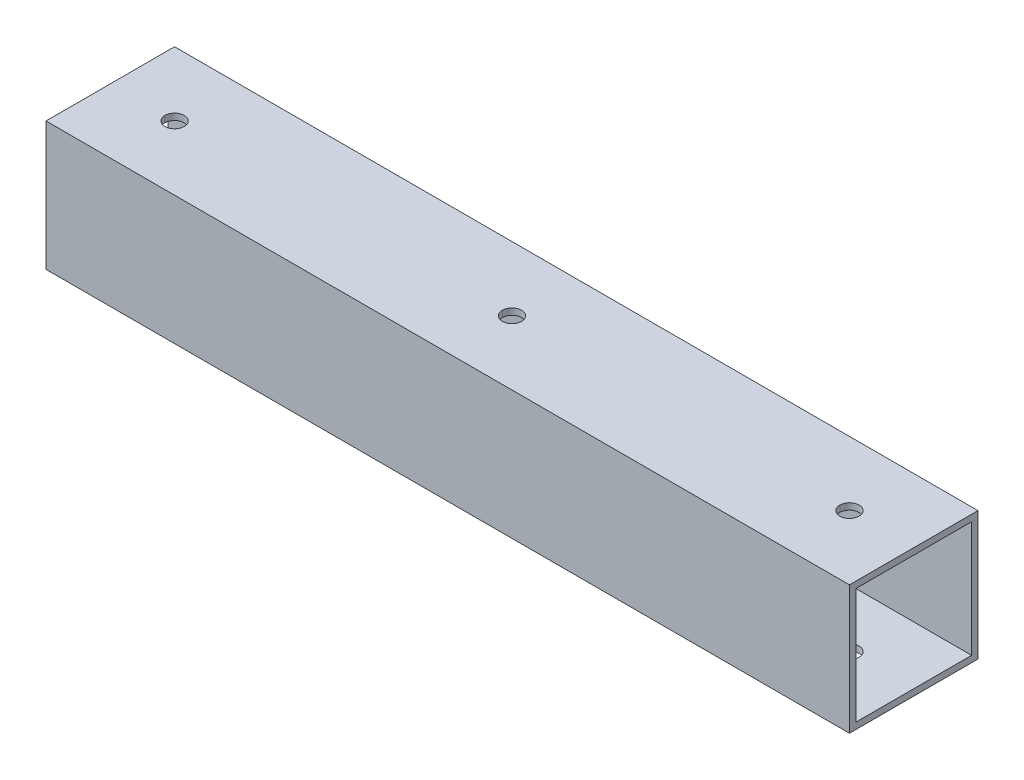
ISO-10303-21;
HEADER;
FILE_DESCRIPTION(('STEP AP214'),'2;1');
FILE_NAME('part.step','',(''),(''),'','','');
FILE_SCHEMA(('AUTOMOTIVE_DESIGN { 1 0 10303 214 1 1 1 1 }'));
ENDSEC;
DATA;
#1=APPLICATION_CONTEXT('core data for automotive mechanical design processes');
#2=APPLICATION_PROTOCOL_DEFINITION('international standard','automotive_design',2000,#1);
#3=PRODUCT_CONTEXT('',#1,'mechanical');
#4=PRODUCT('Part','Part','',(#3));
#5=PRODUCT_RELATED_PRODUCT_CATEGORY('part','',(#4));
#6=PRODUCT_DEFINITION_FORMATION('','',#4);
#7=PRODUCT_DEFINITION_CONTEXT('part definition',#1,'design');
#8=PRODUCT_DEFINITION('design','',#6,#7);
#9=PRODUCT_DEFINITION_SHAPE('','',#8);
#10=(LENGTH_UNIT() NAMED_UNIT(*) SI_UNIT(.MILLI.,.METRE.));
#11=(NAMED_UNIT(*) PLANE_ANGLE_UNIT() SI_UNIT($,.RADIAN.));
#12=(NAMED_UNIT(*) SI_UNIT($,.STERADIAN.) SOLID_ANGLE_UNIT());
#13=UNCERTAINTY_MEASURE_WITH_UNIT(LENGTH_MEASURE(1.E-05),#10,'distance_accuracy_value','');
#14=(GEOMETRIC_REPRESENTATION_CONTEXT(3) GLOBAL_UNCERTAINTY_ASSIGNED_CONTEXT((#13)) GLOBAL_UNIT_ASSIGNED_CONTEXT((#10,
#11,#12)) REPRESENTATION_CONTEXT('',''));
#15=CARTESIAN_POINT('',(0.,0.,0.));
#16=DIRECTION('',(0.,0.,1.));
#17=DIRECTION('',(1.,0.,0.));
#18=AXIS2_PLACEMENT_3D('',#15,#16,#17);
#19=CARTESIAN_POINT('',(-52.5,10.,0.));
#20=DIRECTION('',(0.,1.,0.));
#21=DIRECTION('',(-1.,0.,0.));
#22=AXIS2_PLACEMENT_3D('',#19,#20,#21);
#23=CYLINDRICAL_SURFACE('',#22,1.5);
#24=CARTESIAN_POINT('',(-52.5,-10.,0.));
#25=DIRECTION('',(0.,1.,0.));
#26=DIRECTION('',(1.,0.,0.));
#27=AXIS2_PLACEMENT_3D('',#24,#25,#26);
#28=CIRCLE('',#27,1.5);
#29=CARTESIAN_POINT('',(-51.,-10.,0.));
#30=VERTEX_POINT('',#29);
#31=CARTESIAN_POINT('',(-54.,-10.,0.));
#32=VERTEX_POINT('',#31);
#33=EDGE_CURVE('E31',#30,#32,#28,.T.);
#34=ORIENTED_EDGE('',*,*,#33,.F.);
#35=DIRECTION('',(0.,-1.,0.));
#36=VECTOR('',#35,1.);
#37=CARTESIAN_POINT('',(-51.,-9.,0.));
#38=LINE('',#37,#36);
#39=CARTESIAN_POINT('',(-51.,-9.,0.));
#40=VERTEX_POINT('',#39);
#41=EDGE_CURVE('E11',#40,#30,#38,.T.);
#42=ORIENTED_EDGE('',*,*,#41,.F.);
#43=CARTESIAN_POINT('',(-52.5,-9.,0.));
#44=DIRECTION('',(0.,1.,0.));
#45=DIRECTION('',(1.,0.,0.));
#46=AXIS2_PLACEMENT_3D('',#43,#44,#45);
#47=CIRCLE('',#46,1.5);
#48=CARTESIAN_POINT('',(-54.,-9.,0.));
#49=VERTEX_POINT('',#48);
#50=EDGE_CURVE('E259',#40,#49,#47,.T.);
#51=ORIENTED_EDGE('',*,*,#50,.T.);
#52=DIRECTION('',(0.,-1.,0.));
#53=VECTOR('',#52,1.);
#54=CARTESIAN_POINT('',(-54.,-9.,0.));
#55=LINE('',#54,#53);
#56=EDGE_CURVE('E24',#49,#32,#55,.T.);
#57=ORIENTED_EDGE('',*,*,#56,.T.);
#58=EDGE_LOOP('',(#34,#42,#51,#57));
#59=FACE_BOUND('',#58,.T.);
#60=ADVANCED_FACE('F17',(#59),#23,.F.);
#61=CARTESIAN_POINT('',(-52.5,10.,0.));
#62=DIRECTION('',(0.,1.,0.));
#63=DIRECTION('',(-1.,0.,0.));
#64=AXIS2_PLACEMENT_3D('',#61,#62,#63);
#65=CYLINDRICAL_SURFACE('',#64,1.5);
#66=CARTESIAN_POINT('',(-52.5,-9.,0.));
#67=DIRECTION('',(0.,1.,0.));
#68=DIRECTION('',(-1.,0.,0.));
#69=AXIS2_PLACEMENT_3D('',#66,#67,#68);
#70=CIRCLE('',#69,1.5);
#71=EDGE_CURVE('E257',#49,#40,#70,.T.);
#72=ORIENTED_EDGE('',*,*,#71,.T.);
#73=ORIENTED_EDGE('',*,*,#41,.T.);
#74=CARTESIAN_POINT('',(-52.5,-10.,0.));
#75=DIRECTION('',(0.,1.,0.));
#76=DIRECTION('',(-1.,0.,0.));
#77=AXIS2_PLACEMENT_3D('',#74,#75,#76);
#78=CIRCLE('',#77,1.5);
#79=EDGE_CURVE('E199',#32,#30,#78,.T.);
#80=ORIENTED_EDGE('',*,*,#79,.F.);
#81=ORIENTED_EDGE('',*,*,#56,.F.);
#82=EDGE_LOOP('',(#72,#73,#80,#81));
#83=FACE_BOUND('',#82,.T.);
#84=ADVANCED_FACE('F312',(#83),#65,.F.);
#85=CARTESIAN_POINT('',(52.5,10.,0.));
#86=DIRECTION('',(0.,1.,0.));
#87=DIRECTION('',(-1.,0.,0.));
#88=AXIS2_PLACEMENT_3D('',#85,#86,#87);
#89=CYLINDRICAL_SURFACE('',#88,1.5);
#90=CARTESIAN_POINT('',(52.5,-10.,0.));
#91=DIRECTION('',(0.,1.,0.));
#92=DIRECTION('',(1.,0.,0.));
#93=AXIS2_PLACEMENT_3D('',#90,#91,#92);
#94=CIRCLE('',#93,1.5);
#95=CARTESIAN_POINT('',(54.,-10.,0.));
#96=VERTEX_POINT('',#95);
#97=CARTESIAN_POINT('',(51.,-10.,0.));
#98=VERTEX_POINT('',#97);
#99=EDGE_CURVE('E196',#96,#98,#94,.T.);
#100=ORIENTED_EDGE('',*,*,#99,.F.);
#101=DIRECTION('',(0.,-1.,0.));
#102=VECTOR('',#101,1.);
#103=CARTESIAN_POINT('',(54.,-9.,0.));
#104=LINE('',#103,#102);
#105=CARTESIAN_POINT('',(54.,-9.,0.));
#106=VERTEX_POINT('',#105);
#107=EDGE_CURVE('E305',#106,#96,#104,.T.);
#108=ORIENTED_EDGE('',*,*,#107,.F.);
#109=CARTESIAN_POINT('',(52.5,-9.,0.));
#110=DIRECTION('',(0.,1.,0.));
#111=DIRECTION('',(1.,0.,0.));
#112=AXIS2_PLACEMENT_3D('',#109,#110,#111);
#113=CIRCLE('',#112,1.5);
#114=CARTESIAN_POINT('',(51.,-9.,0.));
#115=VERTEX_POINT('',#114);
#116=EDGE_CURVE('E255',#106,#115,#113,.T.);
#117=ORIENTED_EDGE('',*,*,#116,.T.);
#118=DIRECTION('',(0.,-1.,0.));
#119=VECTOR('',#118,1.);
#120=CARTESIAN_POINT('',(51.,-9.,0.));
#121=LINE('',#120,#119);
#122=EDGE_CURVE('E303',#115,#98,#121,.T.);
#123=ORIENTED_EDGE('',*,*,#122,.T.);
#124=EDGE_LOOP('',(#100,#108,#117,#123));
#125=FACE_BOUND('',#124,.T.);
#126=ADVANCED_FACE('F370',(#125),#89,.F.);
#127=CARTESIAN_POINT('',(52.5,10.,0.));
#128=DIRECTION('',(0.,1.,0.));
#129=DIRECTION('',(-1.,0.,0.));
#130=AXIS2_PLACEMENT_3D('',#127,#128,#129);
#131=CYLINDRICAL_SURFACE('',#130,1.5);
#132=CARTESIAN_POINT('',(52.5,-9.,0.));
#133=DIRECTION('',(0.,1.,0.));
#134=DIRECTION('',(-1.,0.,0.));
#135=AXIS2_PLACEMENT_3D('',#132,#133,#134);
#136=CIRCLE('',#135,1.5);
#137=EDGE_CURVE('E252',#115,#106,#136,.T.);
#138=ORIENTED_EDGE('',*,*,#137,.T.);
#139=ORIENTED_EDGE('',*,*,#107,.T.);
#140=CARTESIAN_POINT('',(52.5,-10.,0.));
#141=DIRECTION('',(0.,1.,0.));
#142=DIRECTION('',(-1.,0.,0.));
#143=AXIS2_PLACEMENT_3D('',#140,#141,#142);
#144=CIRCLE('',#143,1.5);
#145=EDGE_CURVE('E193',#98,#96,#144,.T.);
#146=ORIENTED_EDGE('',*,*,#145,.F.);
#147=ORIENTED_EDGE('',*,*,#122,.F.);
#148=EDGE_LOOP('',(#138,#139,#146,#147));
#149=FACE_BOUND('',#148,.T.);
#150=ADVANCED_FACE('F374',(#149),#131,.F.);
#151=CARTESIAN_POINT('',(0.,10.,0.));
#152=DIRECTION('',(0.,1.,0.));
#153=DIRECTION('',(-1.,0.,0.));
#154=AXIS2_PLACEMENT_3D('',#151,#152,#153);
#155=CYLINDRICAL_SURFACE('',#154,1.5);
#156=CARTESIAN_POINT('',(0.,-10.,0.));
#157=DIRECTION('',(0.,1.,0.));
#158=DIRECTION('',(1.,0.,0.));
#159=AXIS2_PLACEMENT_3D('',#156,#157,#158);
#160=CIRCLE('',#159,1.5);
#161=CARTESIAN_POINT('',(1.5,-10.,0.));
#162=VERTEX_POINT('',#161);
#163=CARTESIAN_POINT('',(-1.5,-10.,0.));
#164=VERTEX_POINT('',#163);
#165=EDGE_CURVE('E189',#162,#164,#160,.T.);
#166=ORIENTED_EDGE('',*,*,#165,.F.);
#167=DIRECTION('',(0.,-1.,0.));
#168=VECTOR('',#167,1.);
#169=CARTESIAN_POINT('',(1.5,-9.,0.));
#170=LINE('',#169,#168);
#171=CARTESIAN_POINT('',(1.5,-9.,0.));
#172=VERTEX_POINT('',#171);
#173=EDGE_CURVE('E300',#172,#162,#170,.T.);
#174=ORIENTED_EDGE('',*,*,#173,.F.);
#175=CARTESIAN_POINT('',(0.,-9.,0.));
#176=DIRECTION('',(0.,1.,0.));
#177=DIRECTION('',(1.,0.,0.));
#178=AXIS2_PLACEMENT_3D('',#175,#176,#177);
#179=CIRCLE('',#178,1.5);
#180=CARTESIAN_POINT('',(-1.5,-9.,0.));
#181=VERTEX_POINT('',#180);
#182=EDGE_CURVE('E250',#172,#181,#179,.T.);
#183=ORIENTED_EDGE('',*,*,#182,.T.);
#184=DIRECTION('',(0.,-1.,0.));
#185=VECTOR('',#184,1.);
#186=CARTESIAN_POINT('',(-1.5,-9.,0.));
#187=LINE('',#186,#185);
#188=EDGE_CURVE('E298',#181,#164,#187,.T.);
#189=ORIENTED_EDGE('',*,*,#188,.T.);
#190=EDGE_LOOP('',(#166,#174,#183,#189));
#191=FACE_BOUND('',#190,.T.);
#192=ADVANCED_FACE('F320',(#191),#155,.F.);
#193=CARTESIAN_POINT('',(0.,10.,0.));
#194=DIRECTION('',(0.,1.,0.));
#195=DIRECTION('',(-1.,0.,0.));
#196=AXIS2_PLACEMENT_3D('',#193,#194,#195);
#197=CYLINDRICAL_SURFACE('',#196,1.5);
#198=CARTESIAN_POINT('',(0.,-9.,0.));
#199=DIRECTION('',(0.,1.,0.));
#200=DIRECTION('',(-1.,0.,0.));
#201=AXIS2_PLACEMENT_3D('',#198,#199,#200);
#202=CIRCLE('',#201,1.5);
#203=EDGE_CURVE('E247',#181,#172,#202,.T.);
#204=ORIENTED_EDGE('',*,*,#203,.T.);
#205=ORIENTED_EDGE('',*,*,#173,.T.);
#206=CARTESIAN_POINT('',(0.,-10.,0.));
#207=DIRECTION('',(0.,1.,0.));
#208=DIRECTION('',(-1.,0.,0.));
#209=AXIS2_PLACEMENT_3D('',#206,#207,#208);
#210=CIRCLE('',#209,1.5);
#211=EDGE_CURVE('E186',#164,#162,#210,.T.);
#212=ORIENTED_EDGE('',*,*,#211,.F.);
#213=ORIENTED_EDGE('',*,*,#188,.F.);
#214=EDGE_LOOP('',(#204,#205,#212,#213));
#215=FACE_BOUND('',#214,.T.);
#216=ADVANCED_FACE('F323',(#215),#197,.F.);
#217=CARTESIAN_POINT('',(-52.5,10.,0.));
#218=DIRECTION('',(0.,1.,0.));
#219=DIRECTION('',(-1.,0.,0.));
#220=AXIS2_PLACEMENT_3D('',#217,#218,#219);
#221=CYLINDRICAL_SURFACE('',#220,1.5);
#222=CARTESIAN_POINT('',(-52.5,9.,0.));
#223=DIRECTION('',(0.,1.,0.));
#224=DIRECTION('',(1.,0.,0.));
#225=AXIS2_PLACEMENT_3D('',#222,#223,#224);
#226=CIRCLE('',#225,1.5);
#227=CARTESIAN_POINT('',(-51.,9.,0.));
#228=VERTEX_POINT('',#227);
#229=CARTESIAN_POINT('',(-54.,9.,0.));
#230=VERTEX_POINT('',#229);
#231=EDGE_CURVE('E280',#228,#230,#226,.T.);
#232=ORIENTED_EDGE('',*,*,#231,.F.);
#233=DIRECTION('',(0.,-1.,0.));
#234=VECTOR('',#233,1.);
#235=CARTESIAN_POINT('',(-51.,10.,0.));
#236=LINE('',#235,#234);
#237=CARTESIAN_POINT('',(-51.,10.,0.));
#238=VERTEX_POINT('',#237);
#239=EDGE_CURVE('E295',#238,#228,#236,.T.);
#240=ORIENTED_EDGE('',*,*,#239,.F.);
#241=CARTESIAN_POINT('',(-52.5,10.,0.));
#242=DIRECTION('',(0.,1.,0.));
#243=DIRECTION('',(1.,0.,0.));
#244=AXIS2_PLACEMENT_3D('',#241,#242,#243);
#245=CIRCLE('',#244,1.5);
#246=CARTESIAN_POINT('',(-54.,10.,0.));
#247=VERTEX_POINT('',#246);
#248=EDGE_CURVE('E222',#238,#247,#245,.T.);
#249=ORIENTED_EDGE('',*,*,#248,.T.);
#250=DIRECTION('',(0.,-1.,0.));
#251=VECTOR('',#250,1.);
#252=CARTESIAN_POINT('',(-54.,10.,0.));
#253=LINE('',#252,#251);
#254=EDGE_CURVE('E293',#247,#230,#253,.T.);
#255=ORIENTED_EDGE('',*,*,#254,.T.);
#256=EDGE_LOOP('',(#232,#240,#249,#255));
#257=FACE_BOUND('',#256,.T.);
#258=ADVANCED_FACE('F385',(#257),#221,.F.);
#259=CARTESIAN_POINT('',(-52.5,10.,0.));
#260=DIRECTION('',(0.,1.,0.));
#261=DIRECTION('',(-1.,0.,0.));
#262=AXIS2_PLACEMENT_3D('',#259,#260,#261);
#263=CYLINDRICAL_SURFACE('',#262,1.5);
#264=CARTESIAN_POINT('',(-52.5,10.,0.));
#265=DIRECTION('',(0.,1.,0.));
#266=DIRECTION('',(-1.,0.,0.));
#267=AXIS2_PLACEMENT_3D('',#264,#265,#266);
#268=CIRCLE('',#267,1.5);
#269=EDGE_CURVE('E219',#247,#238,#268,.T.);
#270=ORIENTED_EDGE('',*,*,#269,.T.);
#271=ORIENTED_EDGE('',*,*,#239,.T.);
#272=CARTESIAN_POINT('',(-52.5,9.,0.));
#273=DIRECTION('',(0.,1.,0.));
#274=DIRECTION('',(-1.,0.,0.));
#275=AXIS2_PLACEMENT_3D('',#272,#273,#274);
#276=CIRCLE('',#275,1.5);
#277=EDGE_CURVE('E277',#230,#228,#276,.T.);
#278=ORIENTED_EDGE('',*,*,#277,.F.);
#279=ORIENTED_EDGE('',*,*,#254,.F.);
#280=EDGE_LOOP('',(#270,#271,#278,#279));
#281=FACE_BOUND('',#280,.T.);
#282=ADVANCED_FACE('F388',(#281),#263,.F.);
#283=CARTESIAN_POINT('',(52.5,10.,0.));
#284=DIRECTION('',(0.,1.,0.));
#285=DIRECTION('',(-1.,0.,0.));
#286=AXIS2_PLACEMENT_3D('',#283,#284,#285);
#287=CYLINDRICAL_SURFACE('',#286,1.5);
#288=CARTESIAN_POINT('',(52.5,9.,0.));
#289=DIRECTION('',(0.,1.,0.));
#290=DIRECTION('',(1.,0.,0.));
#291=AXIS2_PLACEMENT_3D('',#288,#289,#290);
#292=CIRCLE('',#291,1.5);
#293=CARTESIAN_POINT('',(54.,9.,0.));
#294=VERTEX_POINT('',#293);
#295=CARTESIAN_POINT('',(51.,9.,0.));
#296=VERTEX_POINT('',#295);
#297=EDGE_CURVE('E274',#294,#296,#292,.T.);
#298=ORIENTED_EDGE('',*,*,#297,.F.);
#299=DIRECTION('',(0.,-1.,0.));
#300=VECTOR('',#299,1.);
#301=CARTESIAN_POINT('',(54.,10.,0.));
#302=LINE('',#301,#300);
#303=CARTESIAN_POINT('',(54.,10.,0.));
#304=VERTEX_POINT('',#303);
#305=EDGE_CURVE('E290',#304,#294,#302,.T.);
#306=ORIENTED_EDGE('',*,*,#305,.F.);
#307=CARTESIAN_POINT('',(52.5,10.,0.));
#308=DIRECTION('',(0.,1.,0.));
#309=DIRECTION('',(1.,0.,0.));
#310=AXIS2_PLACEMENT_3D('',#307,#308,#309);
#311=CIRCLE('',#310,1.5);
#312=CARTESIAN_POINT('',(51.,10.,0.));
#313=VERTEX_POINT('',#312);
#314=EDGE_CURVE('E217',#304,#313,#311,.T.);
#315=ORIENTED_EDGE('',*,*,#314,.T.);
#316=DIRECTION('',(0.,-1.,0.));
#317=VECTOR('',#316,1.);
#318=CARTESIAN_POINT('',(51.,10.,0.));
#319=LINE('',#318,#317);
#320=EDGE_CURVE('E288',#313,#296,#319,.T.);
#321=ORIENTED_EDGE('',*,*,#320,.T.);
#322=EDGE_LOOP('',(#298,#306,#315,#321));
#323=FACE_BOUND('',#322,.T.);
#324=ADVANCED_FACE('F392',(#323),#287,.F.);
#325=CARTESIAN_POINT('',(52.5,10.,0.));
#326=DIRECTION('',(0.,1.,0.));
#327=DIRECTION('',(-1.,0.,0.));
#328=AXIS2_PLACEMENT_3D('',#325,#326,#327);
#329=CYLINDRICAL_SURFACE('',#328,1.5);
#330=CARTESIAN_POINT('',(52.5,10.,0.));
#331=DIRECTION('',(0.,1.,0.));
#332=DIRECTION('',(-1.,0.,0.));
#333=AXIS2_PLACEMENT_3D('',#330,#331,#332);
#334=CIRCLE('',#333,1.5);
#335=EDGE_CURVE('E214',#313,#304,#334,.T.);
#336=ORIENTED_EDGE('',*,*,#335,.T.);
#337=ORIENTED_EDGE('',*,*,#305,.T.);
#338=CARTESIAN_POINT('',(52.5,9.,0.));
#339=DIRECTION('',(0.,1.,0.));
#340=DIRECTION('',(-1.,0.,0.));
#341=AXIS2_PLACEMENT_3D('',#338,#339,#340);
#342=CIRCLE('',#341,1.5);
#343=EDGE_CURVE('E271',#296,#294,#342,.T.);
#344=ORIENTED_EDGE('',*,*,#343,.F.);
#345=ORIENTED_EDGE('',*,*,#320,.F.);
#346=EDGE_LOOP('',(#336,#337,#344,#345));
#347=FACE_BOUND('',#346,.T.);
#348=ADVANCED_FACE('F396',(#347),#329,.F.);
#349=CARTESIAN_POINT('',(0.,10.,0.));
#350=DIRECTION('',(0.,1.,0.));
#351=DIRECTION('',(-1.,0.,0.));
#352=AXIS2_PLACEMENT_3D('',#349,#350,#351);
#353=CYLINDRICAL_SURFACE('',#352,1.5);
#354=CARTESIAN_POINT('',(0.,9.,0.));
#355=DIRECTION('',(0.,1.,0.));
#356=DIRECTION('',(1.,0.,0.));
#357=AXIS2_PLACEMENT_3D('',#354,#355,#356);
#358=CIRCLE('',#357,1.5);
#359=CARTESIAN_POINT('',(1.5,9.,0.));
#360=VERTEX_POINT('',#359);
#361=CARTESIAN_POINT('',(-1.5,9.,0.));
#362=VERTEX_POINT('',#361);
#363=EDGE_CURVE('E268',#360,#362,#358,.T.);
#364=ORIENTED_EDGE('',*,*,#363,.F.);
#365=DIRECTION('',(0.,-1.,0.));
#366=VECTOR('',#365,1.);
#367=CARTESIAN_POINT('',(1.5,10.,0.));
#368=LINE('',#367,#366);
#369=CARTESIAN_POINT('',(1.5,10.,0.));
#370=VERTEX_POINT('',#369);
#371=EDGE_CURVE('E285',#370,#360,#368,.T.);
#372=ORIENTED_EDGE('',*,*,#371,.F.);
#373=CARTESIAN_POINT('',(0.,10.,0.));
#374=DIRECTION('',(0.,1.,0.));
#375=DIRECTION('',(1.,0.,0.));
#376=AXIS2_PLACEMENT_3D('',#373,#374,#375);
#377=CIRCLE('',#376,1.5);
#378=CARTESIAN_POINT('',(-1.5,10.,0.));
#379=VERTEX_POINT('',#378);
#380=EDGE_CURVE('E212',#370,#379,#377,.T.);
#381=ORIENTED_EDGE('',*,*,#380,.T.);
#382=DIRECTION('',(0.,-1.,0.));
#383=VECTOR('',#382,1.);
#384=CARTESIAN_POINT('',(-1.5,10.,0.));
#385=LINE('',#384,#383);
#386=EDGE_CURVE('E283',#379,#362,#385,.T.);
#387=ORIENTED_EDGE('',*,*,#386,.T.);
#388=EDGE_LOOP('',(#364,#372,#381,#387));
#389=FACE_BOUND('',#388,.T.);
#390=ADVANCED_FACE('F362',(#389),#353,.F.);
#391=CARTESIAN_POINT('',(0.,10.,0.));
#392=DIRECTION('',(0.,1.,0.));
#393=DIRECTION('',(-1.,0.,0.));
#394=AXIS2_PLACEMENT_3D('',#391,#392,#393);
#395=CYLINDRICAL_SURFACE('',#394,1.5);
#396=CARTESIAN_POINT('',(0.,10.,0.));
#397=DIRECTION('',(0.,1.,0.));
#398=DIRECTION('',(-1.,0.,0.));
#399=AXIS2_PLACEMENT_3D('',#396,#397,#398);
#400=CIRCLE('',#399,1.5);
#401=EDGE_CURVE('E209',#379,#370,#400,.T.);
#402=ORIENTED_EDGE('',*,*,#401,.T.);
#403=ORIENTED_EDGE('',*,*,#371,.T.);
#404=CARTESIAN_POINT('',(0.,9.,0.));
#405=DIRECTION('',(0.,1.,0.));
#406=DIRECTION('',(-1.,0.,0.));
#407=AXIS2_PLACEMENT_3D('',#404,#405,#406);
#408=CIRCLE('',#407,1.5);
#409=EDGE_CURVE('E263',#362,#360,#408,.T.);
#410=ORIENTED_EDGE('',*,*,#409,.F.);
#411=ORIENTED_EDGE('',*,*,#386,.F.);
#412=EDGE_LOOP('',(#402,#403,#410,#411));
#413=FACE_BOUND('',#412,.T.);
#414=ADVANCED_FACE('F353',(#413),#395,.F.);
#415=CARTESIAN_POINT('',(-62.5,9.,9.));
#416=DIRECTION('',(0.,-1.,0.));
#417=DIRECTION('',(0.,0.,-1.));
#418=AXIS2_PLACEMENT_3D('',#415,#416,#417);
#419=PLANE('',#418);
#420=ORIENTED_EDGE('',*,*,#231,.T.);
#421=ORIENTED_EDGE('',*,*,#277,.T.);
#422=EDGE_LOOP('',(#420,#421));
#423=FACE_BOUND('',#422,.T.);
#424=ORIENTED_EDGE('',*,*,#297,.T.);
#425=ORIENTED_EDGE('',*,*,#343,.T.);
#426=EDGE_LOOP('',(#424,#425));
#427=FACE_BOUND('',#426,.T.);
#428=ORIENTED_EDGE('',*,*,#363,.T.);
#429=ORIENTED_EDGE('',*,*,#409,.T.);
#430=EDGE_LOOP('',(#428,#429));
#431=FACE_BOUND('',#430,.T.);
#432=DIRECTION('',(1.,0.,0.));
#433=VECTOR('',#432,1.);
#434=CARTESIAN_POINT('',(-62.5,9.,-9.));
#435=LINE('',#434,#433);
#436=CARTESIAN_POINT('',(-62.5,9.,-9.));
#437=VERTEX_POINT('',#436);
#438=CARTESIAN_POINT('',(62.5,9.,-9.));
#439=VERTEX_POINT('',#438);
#440=EDGE_CURVE('E261',#437,#439,#435,.T.);
#441=ORIENTED_EDGE('',*,*,#440,.T.);
#442=DIRECTION('',(0.,0.,-1.));
#443=VECTOR('',#442,1.);
#444=CARTESIAN_POINT('',(62.5,9.,9.));
#445=LINE('',#444,#443);
#446=CARTESIAN_POINT('',(62.5,9.,9.));
#447=VERTEX_POINT('',#446);
#448=EDGE_CURVE('E239',#447,#439,#445,.T.);
#449=ORIENTED_EDGE('',*,*,#448,.F.);
#450=DIRECTION('',(1.,0.,0.));
#451=VECTOR('',#450,1.);
#452=CARTESIAN_POINT('',(-62.5,9.,9.));
#453=LINE('',#452,#451);
#454=CARTESIAN_POINT('',(-62.5,9.,9.));
#455=VERTEX_POINT('',#454);
#456=EDGE_CURVE('E244',#455,#447,#453,.T.);
#457=ORIENTED_EDGE('',*,*,#456,.F.);
#458=DIRECTION('',(0.,0.,-1.));
#459=VECTOR('',#458,1.);
#460=CARTESIAN_POINT('',(-62.5,9.,9.));
#461=LINE('',#460,#459);
#462=EDGE_CURVE('E181',#455,#437,#461,.T.);
#463=ORIENTED_EDGE('',*,*,#462,.T.);
#464=EDGE_LOOP('',(#441,#449,#457,#463));
#465=FACE_BOUND('',#464,.T.);
#466=ADVANCED_FACE('F351',(#423,#427,#431,#465),#419,.T.);
#467=CARTESIAN_POINT('',(-62.5,9.,-9.));
#468=DIRECTION('',(0.,0.,1.));
#469=DIRECTION('',(0.,-1.,0.));
#470=AXIS2_PLACEMENT_3D('',#467,#468,#469);
#471=PLANE('',#470);
#472=DIRECTION('',(1.,0.,0.));
#473=VECTOR('',#472,1.);
#474=CARTESIAN_POINT('',(-62.5,-9.,-9.));
#475=LINE('',#474,#473);
#476=CARTESIAN_POINT('',(-62.5,-9.,-9.));
#477=VERTEX_POINT('',#476);
#478=CARTESIAN_POINT('',(62.5,-9.,-9.));
#479=VERTEX_POINT('',#478);
#480=EDGE_CURVE('E245',#477,#479,#475,.T.);
#481=ORIENTED_EDGE('',*,*,#480,.T.);
#482=DIRECTION('',(0.,-1.,0.));
#483=VECTOR('',#482,1.);
#484=CARTESIAN_POINT('',(62.5,9.,-9.));
#485=LINE('',#484,#483);
#486=EDGE_CURVE('E236',#439,#479,#485,.T.);
#487=ORIENTED_EDGE('',*,*,#486,.F.);
#488=ORIENTED_EDGE('',*,*,#440,.F.);
#489=DIRECTION('',(0.,-1.,0.));
#490=VECTOR('',#489,1.);
#491=CARTESIAN_POINT('',(-62.5,9.,-9.));
#492=LINE('',#491,#490);
#493=EDGE_CURVE('E183',#437,#477,#492,.T.);
#494=ORIENTED_EDGE('',*,*,#493,.T.);
#495=EDGE_LOOP('',(#481,#487,#488,#494));
#496=FACE_BOUND('',#495,.T.);
#497=ADVANCED_FACE('F331',(#496),#471,.T.);
#498=CARTESIAN_POINT('',(-62.5,-9.,-9.));
#499=DIRECTION('',(0.,1.,0.));
#500=DIRECTION('',(0.,0.,1.));
#501=AXIS2_PLACEMENT_3D('',#498,#499,#500);
#502=PLANE('',#501);
#503=ORIENTED_EDGE('',*,*,#50,.F.);
#504=ORIENTED_EDGE('',*,*,#71,.F.);
#505=EDGE_LOOP('',(#503,#504));
#506=FACE_BOUND('',#505,.T.);
#507=ORIENTED_EDGE('',*,*,#116,.F.);
#508=ORIENTED_EDGE('',*,*,#137,.F.);
#509=EDGE_LOOP('',(#507,#508));
#510=FACE_BOUND('',#509,.T.);
#511=ORIENTED_EDGE('',*,*,#182,.F.);
#512=ORIENTED_EDGE('',*,*,#203,.F.);
#513=EDGE_LOOP('',(#511,#512));
#514=FACE_BOUND('',#513,.T.);
#515=DIRECTION('',(1.,0.,0.));
#516=VECTOR('',#515,1.);
#517=CARTESIAN_POINT('',(-62.5,-9.,9.));
#518=LINE('',#517,#516);
#519=CARTESIAN_POINT('',(-62.5,-9.,9.));
#520=VERTEX_POINT('',#519);
#521=CARTESIAN_POINT('',(62.5,-9.,9.));
#522=VERTEX_POINT('',#521);
#523=EDGE_CURVE('E242',#520,#522,#518,.T.);
#524=ORIENTED_EDGE('',*,*,#523,.T.);
#525=DIRECTION('',(0.,0.,1.));
#526=VECTOR('',#525,1.);
#527=CARTESIAN_POINT('',(62.5,-9.,-9.));
#528=LINE('',#527,#526);
#529=EDGE_CURVE('E233',#479,#522,#528,.T.);
#530=ORIENTED_EDGE('',*,*,#529,.F.);
#531=ORIENTED_EDGE('',*,*,#480,.F.);
#532=DIRECTION('',(0.,0.,1.));
#533=VECTOR('',#532,1.);
#534=CARTESIAN_POINT('',(-62.5,-9.,-9.));
#535=LINE('',#534,#533);
#536=EDGE_CURVE('E171',#477,#520,#535,.T.);
#537=ORIENTED_EDGE('',*,*,#536,.T.);
#538=EDGE_LOOP('',(#524,#530,#531,#537));
#539=FACE_BOUND('',#538,.T.);
#540=ADVANCED_FACE('F327',(#506,#510,#514,#539),#502,.T.);
#541=CARTESIAN_POINT('',(-62.5,-9.,9.));
#542=DIRECTION('',(0.,0.,-1.));
#543=DIRECTION('',(0.,1.,0.));
#544=AXIS2_PLACEMENT_3D('',#541,#542,#543);
#545=PLANE('',#544);
#546=ORIENTED_EDGE('',*,*,#456,.T.);
#547=DIRECTION('',(0.,1.,0.));
#548=VECTOR('',#547,1.);
#549=CARTESIAN_POINT('',(62.5,-9.,9.));
#550=LINE('',#549,#548);
#551=EDGE_CURVE('E230',#522,#447,#550,.T.);
#552=ORIENTED_EDGE('',*,*,#551,.F.);
#553=ORIENTED_EDGE('',*,*,#523,.F.);
#554=DIRECTION('',(0.,1.,0.));
#555=VECTOR('',#554,1.);
#556=CARTESIAN_POINT('',(-62.5,-9.,9.));
#557=LINE('',#556,#555);
#558=EDGE_CURVE('E161',#520,#455,#557,.T.);
#559=ORIENTED_EDGE('',*,*,#558,.T.);
#560=EDGE_LOOP('',(#546,#552,#553,#559));
#561=FACE_BOUND('',#560,.T.);
#562=ADVANCED_FACE('F330',(#561),#545,.T.);
#563=CARTESIAN_POINT('',(62.5,0.,0.));
#564=DIRECTION('',(1.,0.,0.));
#565=DIRECTION('',(0.,1.,0.));
#566=AXIS2_PLACEMENT_3D('',#563,#564,#565);
#567=PLANE('',#566);
#568=ORIENTED_EDGE('',*,*,#448,.T.);
#569=ORIENTED_EDGE('',*,*,#486,.T.);
#570=ORIENTED_EDGE('',*,*,#529,.T.);
#571=ORIENTED_EDGE('',*,*,#551,.T.);
#572=EDGE_LOOP('',(#568,#569,#570,#571));
#573=FACE_BOUND('',#572,.T.);
#574=DIRECTION('',(0.,1.,0.));
#575=VECTOR('',#574,1.);
#576=CARTESIAN_POINT('',(62.5,-10.,-10.));
#577=LINE('',#576,#575);
#578=CARTESIAN_POINT('',(62.5,-10.,-10.));
#579=VERTEX_POINT('',#578);
#580=CARTESIAN_POINT('',(62.5,10.,-10.));
#581=VERTEX_POINT('',#580);
#582=EDGE_CURVE('E224',#579,#581,#577,.T.);
#583=ORIENTED_EDGE('',*,*,#582,.T.);
#584=DIRECTION('',(0.,0.,1.));
#585=VECTOR('',#584,1.);
#586=CARTESIAN_POINT('',(62.5,10.,-10.));
#587=LINE('',#586,#585);
#588=CARTESIAN_POINT('',(62.5,10.,10.));
#589=VERTEX_POINT('',#588);
#590=EDGE_CURVE('E208',#581,#589,#587,.T.);
#591=ORIENTED_EDGE('',*,*,#590,.T.);
#592=DIRECTION('',(0.,-1.,0.));
#593=VECTOR('',#592,1.);
#594=CARTESIAN_POINT('',(62.5,10.,10.));
#595=LINE('',#594,#593);
#596=CARTESIAN_POINT('',(62.5,-10.,10.));
#597=VERTEX_POINT('',#596);
#598=EDGE_CURVE('E204',#589,#597,#595,.T.);
#599=ORIENTED_EDGE('',*,*,#598,.T.);
#600=DIRECTION('',(0.,0.,-1.));
#601=VECTOR('',#600,1.);
#602=CARTESIAN_POINT('',(62.5,-10.,10.));
#603=LINE('',#602,#601);
#604=EDGE_CURVE('E170',#597,#579,#603,.T.);
#605=ORIENTED_EDGE('',*,*,#604,.T.);
#606=EDGE_LOOP('',(#583,#591,#599,#605));
#607=FACE_BOUND('',#606,.T.);
#608=ADVANCED_FACE('F342',(#573,#607),#567,.T.);
#609=CARTESIAN_POINT('',(-62.5,-10.,-10.));
#610=DIRECTION('',(0.,0.,-1.));
#611=DIRECTION('',(0.,1.,0.));
#612=AXIS2_PLACEMENT_3D('',#609,#610,#611);
#613=PLANE('',#612);
#614=DIRECTION('',(1.,0.,0.));
#615=VECTOR('',#614,1.);
#616=CARTESIAN_POINT('',(-62.5,10.,-10.));
#617=LINE('',#616,#615);
#618=CARTESIAN_POINT('',(-62.5,10.,-10.));
#619=VERTEX_POINT('',#618);
#620=EDGE_CURVE('E205',#619,#581,#617,.T.);
#621=ORIENTED_EDGE('',*,*,#620,.T.);
#622=ORIENTED_EDGE('',*,*,#582,.F.);
#623=DIRECTION('',(1.,0.,0.));
#624=VECTOR('',#623,1.);
#625=CARTESIAN_POINT('',(-62.5,-10.,-10.));
#626=LINE('',#625,#624);
#627=CARTESIAN_POINT('',(-62.5,-10.,-10.));
#628=VERTEX_POINT('',#627);
#629=EDGE_CURVE('E190',#628,#579,#626,.T.);
#630=ORIENTED_EDGE('',*,*,#629,.F.);
#631=DIRECTION('',(0.,1.,0.));
#632=VECTOR('',#631,1.);
#633=CARTESIAN_POINT('',(-62.5,-10.,-10.));
#634=LINE('',#633,#632);
#635=EDGE_CURVE('E174',#628,#619,#634,.T.);
#636=ORIENTED_EDGE('',*,*,#635,.T.);
#637=EDGE_LOOP('',(#621,#622,#630,#636));
#638=FACE_BOUND('',#637,.T.);
#639=ADVANCED_FACE('F414',(#638),#613,.T.);
#640=CARTESIAN_POINT('',(-62.5,10.,-10.));
#641=DIRECTION('',(0.,1.,0.));
#642=DIRECTION('',(0.,0.,1.));
#643=AXIS2_PLACEMENT_3D('',#640,#641,#642);
#644=PLANE('',#643);
#645=ORIENTED_EDGE('',*,*,#248,.F.);
#646=ORIENTED_EDGE('',*,*,#269,.F.);
#647=EDGE_LOOP('',(#645,#646));
#648=FACE_BOUND('',#647,.T.);
#649=ORIENTED_EDGE('',*,*,#314,.F.);
#650=ORIENTED_EDGE('',*,*,#335,.F.);
#651=EDGE_LOOP('',(#649,#650));
#652=FACE_BOUND('',#651,.T.);
#653=ORIENTED_EDGE('',*,*,#380,.F.);
#654=ORIENTED_EDGE('',*,*,#401,.F.);
#655=EDGE_LOOP('',(#653,#654));
#656=FACE_BOUND('',#655,.T.);
#657=DIRECTION('',(1.,0.,0.));
#658=VECTOR('',#657,1.);
#659=CARTESIAN_POINT('',(-62.5,10.,10.));
#660=LINE('',#659,#658);
#661=CARTESIAN_POINT('',(-62.5,10.,10.));
#662=VERTEX_POINT('',#661);
#663=EDGE_CURVE('E157',#662,#589,#660,.T.);
#664=ORIENTED_EDGE('',*,*,#663,.T.);
#665=ORIENTED_EDGE('',*,*,#590,.F.);
#666=ORIENTED_EDGE('',*,*,#620,.F.);
#667=DIRECTION('',(0.,0.,1.));
#668=VECTOR('',#667,1.);
#669=CARTESIAN_POINT('',(-62.5,10.,-10.));
#670=LINE('',#669,#668);
#671=EDGE_CURVE('E162',#619,#662,#670,.T.);
#672=ORIENTED_EDGE('',*,*,#671,.T.);
#673=EDGE_LOOP('',(#664,#665,#666,#672));
#674=FACE_BOUND('',#673,.T.);
#675=ADVANCED_FACE('F411',(#648,#652,#656,#674),#644,.T.);
#676=CARTESIAN_POINT('',(-62.5,10.,10.));
#677=DIRECTION('',(0.,0.,1.));
#678=DIRECTION('',(0.,-1.,0.));
#679=AXIS2_PLACEMENT_3D('',#676,#677,#678);
#680=PLANE('',#679);
#681=DIRECTION('',(1.,0.,0.));
#682=VECTOR('',#681,1.);
#683=CARTESIAN_POINT('',(-62.5,-10.,10.));
#684=LINE('',#683,#682);
#685=CARTESIAN_POINT('',(-62.5,-10.,10.));
#686=VERTEX_POINT('',#685);
#687=EDGE_CURVE('E154',#686,#597,#684,.T.);
#688=ORIENTED_EDGE('',*,*,#687,.T.);
#689=ORIENTED_EDGE('',*,*,#598,.F.);
#690=ORIENTED_EDGE('',*,*,#663,.F.);
#691=DIRECTION('',(0.,-1.,0.));
#692=VECTOR('',#691,1.);
#693=CARTESIAN_POINT('',(-62.5,10.,10.));
#694=LINE('',#693,#692);
#695=EDGE_CURVE('E150',#662,#686,#694,.T.);
#696=ORIENTED_EDGE('',*,*,#695,.T.);
#697=EDGE_LOOP('',(#688,#689,#690,#696));
#698=FACE_BOUND('',#697,.T.);
#699=ADVANCED_FACE('F152',(#698),#680,.T.);
#700=CARTESIAN_POINT('',(-62.5,-10.,10.));
#701=DIRECTION('',(0.,-1.,0.));
#702=DIRECTION('',(0.,0.,-1.));
#703=AXIS2_PLACEMENT_3D('',#700,#701,#702);
#704=PLANE('',#703);
#705=ORIENTED_EDGE('',*,*,#33,.T.);
#706=ORIENTED_EDGE('',*,*,#79,.T.);
#707=EDGE_LOOP('',(#705,#706));
#708=FACE_BOUND('',#707,.T.);
#709=ORIENTED_EDGE('',*,*,#99,.T.);
#710=ORIENTED_EDGE('',*,*,#145,.T.);
#711=EDGE_LOOP('',(#709,#710));
#712=FACE_BOUND('',#711,.T.);
#713=ORIENTED_EDGE('',*,*,#165,.T.);
#714=ORIENTED_EDGE('',*,*,#211,.T.);
#715=EDGE_LOOP('',(#713,#714));
#716=FACE_BOUND('',#715,.T.);
#717=ORIENTED_EDGE('',*,*,#629,.T.);
#718=ORIENTED_EDGE('',*,*,#604,.F.);
#719=ORIENTED_EDGE('',*,*,#687,.F.);
#720=DIRECTION('',(0.,0.,-1.));
#721=VECTOR('',#720,1.);
#722=CARTESIAN_POINT('',(-62.5,-10.,10.));
#723=LINE('',#722,#721);
#724=EDGE_CURVE('E168',#686,#628,#723,.T.);
#725=ORIENTED_EDGE('',*,*,#724,.T.);
#726=EDGE_LOOP('',(#717,#718,#719,#725));
#727=FACE_BOUND('',#726,.T.);
#728=ADVANCED_FACE('F167',(#708,#712,#716,#727),#704,.T.);
#729=CARTESIAN_POINT('',(-62.5,0.,0.));
#730=DIRECTION('',(1.,0.,0.));
#731=DIRECTION('',(0.,1.,0.));
#732=AXIS2_PLACEMENT_3D('',#729,#730,#731);
#733=PLANE('',#732);
#734=ORIENTED_EDGE('',*,*,#536,.F.);
#735=ORIENTED_EDGE('',*,*,#493,.F.);
#736=ORIENTED_EDGE('',*,*,#462,.F.);
#737=ORIENTED_EDGE('',*,*,#558,.F.);
#738=EDGE_LOOP('',(#734,#735,#736,#737));
#739=FACE_BOUND('',#738,.T.);
#740=ORIENTED_EDGE('',*,*,#695,.F.);
#741=ORIENTED_EDGE('',*,*,#671,.F.);
#742=ORIENTED_EDGE('',*,*,#635,.F.);
#743=ORIENTED_EDGE('',*,*,#724,.F.);
#744=EDGE_LOOP('',(#740,#741,#742,#743));
#745=FACE_BOUND('',#744,.T.);
#746=ADVANCED_FACE('F173',(#739,#745),#733,.F.);
#747=CLOSED_SHELL('',(#60,#84,#126,#150,#192,#216,#258,#282,#324,#348,#390,#414,#466,#497,#540,
#562,#608,#639,#675,#699,#728,#746));
#748=MANIFOLD_SOLID_BREP('B1',#747);
#749=ADVANCED_BREP_SHAPE_REPRESENTATION('',(#18,#748),#14);
#750=SHAPE_DEFINITION_REPRESENTATION(#9,#749);
ENDSEC;
END-ISO-10303-21;
